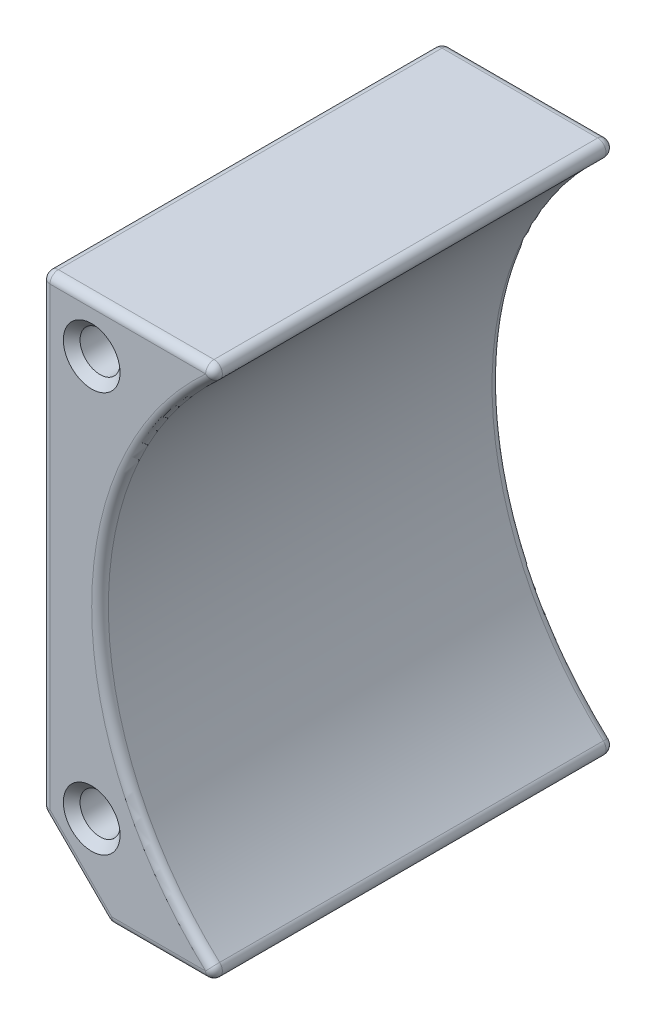
ISO-10303-21;
HEADER;
FILE_DESCRIPTION(('STEP AP214'),'2;1');
FILE_NAME('part.step','',(''),(''),'','','');
FILE_SCHEMA(('AUTOMOTIVE_DESIGN { 1 0 10303 214 1 1 1 1 }'));
ENDSEC;
DATA;
#1=APPLICATION_CONTEXT('core data for automotive mechanical design processes');
#2=APPLICATION_PROTOCOL_DEFINITION('international standard','automotive_design',2000,#1);
#3=PRODUCT_CONTEXT('',#1,'mechanical');
#4=PRODUCT('Part','Part','',(#3));
#5=PRODUCT_RELATED_PRODUCT_CATEGORY('part','',(#4));
#6=PRODUCT_DEFINITION_FORMATION('','',#4);
#7=PRODUCT_DEFINITION_CONTEXT('part definition',#1,'design');
#8=PRODUCT_DEFINITION('design','',#6,#7);
#9=PRODUCT_DEFINITION_SHAPE('','',#8);
#10=(LENGTH_UNIT() NAMED_UNIT(*) SI_UNIT(.MILLI.,.METRE.));
#11=(NAMED_UNIT(*) PLANE_ANGLE_UNIT() SI_UNIT($,.RADIAN.));
#12=(NAMED_UNIT(*) SI_UNIT($,.STERADIAN.) SOLID_ANGLE_UNIT());
#13=UNCERTAINTY_MEASURE_WITH_UNIT(LENGTH_MEASURE(1.E-05),#10,'distance_accuracy_value','');
#14=(GEOMETRIC_REPRESENTATION_CONTEXT(3) GLOBAL_UNCERTAINTY_ASSIGNED_CONTEXT((#13)) GLOBAL_UNIT_ASSIGNED_CONTEXT((#10,
#11,#12)) REPRESENTATION_CONTEXT('',''));
#15=CARTESIAN_POINT('',(0.,0.,0.));
#16=DIRECTION('',(0.,0.,1.));
#17=DIRECTION('',(1.,0.,0.));
#18=AXIS2_PLACEMENT_3D('',#15,#16,#17);
#19=CARTESIAN_POINT('',(0.,0.,38.1));
#20=DIRECTION('',(1.,0.,0.));
#21=DIRECTION('',(0.,0.,-1.));
#22=AXIS2_PLACEMENT_3D('',#19,#20,#21);
#23=PLANE('',#22);
#24=DIRECTION('',(0.,0.,-1.));
#25=VECTOR('',#24,1.);
#26=CARTESIAN_POINT('',(0.,6.67878201513367,38.1));
#27=LINE('',#26,#25);
#28=CARTESIAN_POINT('',(0.,6.67878201513367,0.793750000000003));
#29=VERTEX_POINT('',#28);
#30=CARTESIAN_POINT('',(0.,6.67878201513367,37.30625));
#31=VERTEX_POINT('',#30);
#32=EDGE_CURVE('E205',#29,#31,#27,.F.);
#33=ORIENTED_EDGE('',*,*,#32,.T.);
#34=DIRECTION('',(0.,-1.,0.));
#35=VECTOR('',#34,1.);
#36=CARTESIAN_POINT('',(0.,50.8,37.30625));
#37=LINE('',#36,#35);
#38=CARTESIAN_POINT('',(0.,50.00625,37.30625));
#39=VERTEX_POINT('',#38);
#40=EDGE_CURVE('E208',#31,#39,#37,.F.);
#41=ORIENTED_EDGE('',*,*,#40,.T.);
#42=DIRECTION('',(0.,0.,-1.));
#43=VECTOR('',#42,1.);
#44=CARTESIAN_POINT('',(0.,50.00625,38.1));
#45=LINE('',#44,#43);
#46=CARTESIAN_POINT('',(0.,50.00625,0.793750000000003));
#47=VERTEX_POINT('',#46);
#48=EDGE_CURVE('E203',#39,#47,#45,.T.);
#49=ORIENTED_EDGE('',*,*,#48,.T.);
#50=DIRECTION('',(0.,-1.,0.));
#51=VECTOR('',#50,1.);
#52=CARTESIAN_POINT('',(0.,0.,0.793750000000003));
#53=LINE('',#52,#51);
#54=EDGE_CURVE('E201',#47,#29,#53,.T.);
#55=ORIENTED_EDGE('',*,*,#54,.T.);
#56=EDGE_LOOP('',(#33,#41,#49,#55));
#57=FACE_BOUND('',#56,.T.);
#58=ADVANCED_FACE('F41',(#57),#23,.F.);
#59=CARTESIAN_POINT('',(0.,0.,38.1));
#60=DIRECTION('',(0.,1.,0.));
#61=DIRECTION('',(0.,0.,1.));
#62=AXIS2_PLACEMENT_3D('',#59,#60,#61);
#63=PLANE('',#62);
#64=DIRECTION('',(0.,0.,-1.));
#65=VECTOR('',#64,1.);
#66=CARTESIAN_POINT('',(15.6073041369537,0.,38.1));
#67=LINE('',#66,#65);
#68=CARTESIAN_POINT('',(15.6073041369537,0.,0.793750000000003));
#69=VERTEX_POINT('',#68);
#70=CARTESIAN_POINT('',(15.6073041369537,0.,37.30625));
#71=VERTEX_POINT('',#70);
#72=EDGE_CURVE('E223',#69,#71,#67,.F.);
#73=ORIENTED_EDGE('',*,*,#72,.T.);
#74=DIRECTION('',(1.,0.,0.));
#75=VECTOR('',#74,1.);
#76=CARTESIAN_POINT('',(6.34999999999999,0.,37.30625));
#77=LINE('',#76,#75);
#78=CARTESIAN_POINT('',(6.67878201513364,0.,37.30625));
#79=VERTEX_POINT('',#78);
#80=EDGE_CURVE('E228',#71,#79,#77,.F.);
#81=ORIENTED_EDGE('',*,*,#80,.T.);
#82=DIRECTION('',(0.,0.,1.));
#83=VECTOR('',#82,1.);
#84=CARTESIAN_POINT('',(6.67878201513364,0.,0.));
#85=LINE('',#84,#83);
#86=CARTESIAN_POINT('',(6.67878201513364,0.,0.793750000000003));
#87=VERTEX_POINT('',#86);
#88=EDGE_CURVE('E225',#79,#87,#85,.F.);
#89=ORIENTED_EDGE('',*,*,#88,.T.);
#90=DIRECTION('',(1.,0.,0.));
#91=VECTOR('',#90,1.);
#92=CARTESIAN_POINT('',(0.,0.,0.793750000000003));
#93=LINE('',#92,#91);
#94=EDGE_CURVE('E221',#87,#69,#93,.T.);
#95=ORIENTED_EDGE('',*,*,#94,.T.);
#96=EDGE_LOOP('',(#73,#81,#89,#95));
#97=FACE_BOUND('',#96,.T.);
#98=ADVANCED_FACE('F420',(#97),#63,.F.);
#99=CARTESIAN_POINT('',(38.1,25.4,38.1));
#100=DIRECTION('',(0.,0.,-1.));
#101=DIRECTION('',(-1.,0.,0.));
#102=AXIS2_PLACEMENT_3D('',#99,#100,#101);
#103=CYLINDRICAL_SURFACE('',#102,32.54375);
#104=DIRECTION('',(0.,0.,-1.));
#105=VECTOR('',#104,1.);
#106=CARTESIAN_POINT('',(16.1428445146453,49.4203869047619,38.1));
#107=LINE('',#106,#105);
#108=CARTESIAN_POINT('',(16.1428445146453,49.4203869047619,0.793750000000003));
#109=VERTEX_POINT('',#108);
#110=CARTESIAN_POINT('',(16.1428445146453,49.4203869047619,37.30625));
#111=VERTEX_POINT('',#110);
#112=EDGE_CURVE('E232',#109,#111,#107,.F.);
#113=ORIENTED_EDGE('',*,*,#112,.T.);
#114=CARTESIAN_POINT('',(38.1,25.4,37.30625));
#115=DIRECTION('',(0.,0.,1.));
#116=DIRECTION('',(1.,0.,0.));
#117=AXIS2_PLACEMENT_3D('',#114,#115,#116);
#118=CIRCLE('',#117,32.54375);
#119=CARTESIAN_POINT('',(16.1428445146453,1.37961309523809,37.30625));
#120=VERTEX_POINT('',#119);
#121=EDGE_CURVE('E237',#111,#120,#118,.T.);
#122=ORIENTED_EDGE('',*,*,#121,.T.);
#123=DIRECTION('',(0.,0.,-1.));
#124=VECTOR('',#123,1.);
#125=CARTESIAN_POINT('',(16.1428445146453,1.3796130952381,38.1));
#126=LINE('',#125,#124);
#127=CARTESIAN_POINT('',(16.1428445146453,1.37961309523809,0.793750000000003));
#128=VERTEX_POINT('',#127);
#129=EDGE_CURVE('E234',#120,#128,#126,.T.);
#130=ORIENTED_EDGE('',*,*,#129,.T.);
#131=CARTESIAN_POINT('',(38.1,25.4,0.793750000000003));
#132=DIRECTION('',(0.,0.,1.));
#133=DIRECTION('',(1.,0.,0.));
#134=AXIS2_PLACEMENT_3D('',#131,#132,#133);
#135=CIRCLE('',#134,32.54375);
#136=EDGE_CURVE('E230',#128,#109,#135,.F.);
#137=ORIENTED_EDGE('',*,*,#136,.T.);
#138=EDGE_LOOP('',(#113,#122,#130,#137));
#139=FACE_BOUND('',#138,.T.);
#140=ADVANCED_FACE('F440',(#139),#103,.F.);
#141=CARTESIAN_POINT('',(0.,50.8,38.1));
#142=DIRECTION('',(0.,-1.,0.));
#143=DIRECTION('',(0.,0.,-1.));
#144=AXIS2_PLACEMENT_3D('',#141,#142,#143);
#145=PLANE('',#144);
#146=DIRECTION('',(0.,0.,-1.));
#147=VECTOR('',#146,1.);
#148=CARTESIAN_POINT('',(0.79375,50.8,38.1));
#149=LINE('',#148,#147);
#150=CARTESIAN_POINT('',(0.79375,50.8,0.793750000000003));
#151=VERTEX_POINT('',#150);
#152=CARTESIAN_POINT('',(0.79375,50.8,37.30625));
#153=VERTEX_POINT('',#152);
#154=EDGE_CURVE('E62',#151,#153,#149,.F.);
#155=ORIENTED_EDGE('',*,*,#154,.T.);
#156=DIRECTION('',(-1.,0.,0.));
#157=VECTOR('',#156,1.);
#158=CARTESIAN_POINT('',(17.7545910814626,50.8,37.30625));
#159=LINE('',#158,#157);
#160=CARTESIAN_POINT('',(15.6073041369537,50.8,37.30625));
#161=VERTEX_POINT('',#160);
#162=EDGE_CURVE('E57',#153,#161,#159,.F.);
#163=ORIENTED_EDGE('',*,*,#162,.T.);
#164=DIRECTION('',(0.,0.,-1.));
#165=VECTOR('',#164,1.);
#166=CARTESIAN_POINT('',(15.6073041369537,50.8,38.1));
#167=LINE('',#166,#165);
#168=CARTESIAN_POINT('',(15.6073041369537,50.8,0.793750000000003));
#169=VERTEX_POINT('',#168);
#170=EDGE_CURVE('E242',#161,#169,#167,.T.);
#171=ORIENTED_EDGE('',*,*,#170,.T.);
#172=DIRECTION('',(-1.,0.,0.));
#173=VECTOR('',#172,1.);
#174=CARTESIAN_POINT('',(0.,50.8,0.793750000000003));
#175=LINE('',#174,#173);
#176=EDGE_CURVE('E239',#169,#151,#175,.T.);
#177=ORIENTED_EDGE('',*,*,#176,.T.);
#178=EDGE_LOOP('',(#155,#163,#171,#177));
#179=FACE_BOUND('',#178,.T.);
#180=ADVANCED_FACE('F502',(#179),#145,.F.);
#181=CARTESIAN_POINT('',(38.1,25.4,38.1));
#182=DIRECTION('',(0.,0.,1.));
#183=DIRECTION('',(1.,0.,0.));
#184=AXIS2_PLACEMENT_3D('',#181,#182,#183);
#185=PLANE('',#184);
#186=CARTESIAN_POINT('',(4.7625,7.9375,38.1));
#187=DIRECTION('',(0.,0.,1.));
#188=DIRECTION('',(1.,0.,0.));
#189=AXIS2_PLACEMENT_3D('',#186,#187,#188);
#190=CIRCLE('',#189,2.69875000000003);
#191=CARTESIAN_POINT('',(7.46125000000003,7.9375,38.1));
#192=VERTEX_POINT('',#191);
#193=EDGE_CURVE('E320',#192,#192,#190,.F.);
#194=ORIENTED_EDGE('',*,*,#193,.T.);
#195=EDGE_LOOP('',(#194));
#196=FACE_BOUND('',#195,.T.);
#197=CARTESIAN_POINT('',(4.7625,46.0375,38.1));
#198=DIRECTION('',(0.,0.,1.));
#199=DIRECTION('',(1.,0.,0.));
#200=AXIS2_PLACEMENT_3D('',#197,#198,#199);
#201=CIRCLE('',#200,2.69875000000003);
#202=CARTESIAN_POINT('',(7.46125000000003,46.0375,38.1));
#203=VERTEX_POINT('',#202);
#204=EDGE_CURVE('E317',#203,#203,#201,.F.);
#205=ORIENTED_EDGE('',*,*,#204,.T.);
#206=EDGE_LOOP('',(#205));
#207=FACE_BOUND('',#206,.T.);
#208=DIRECTION('',(1.,0.,0.));
#209=VECTOR('',#208,1.);
#210=CARTESIAN_POINT('',(17.7545910814626,0.793749999999999,38.1));
#211=LINE('',#210,#209);
#212=CARTESIAN_POINT('',(6.67878201513364,0.793749999999999,38.1));
#213=VERTEX_POINT('',#212);
#214=CARTESIAN_POINT('',(15.6073041369537,0.793749999999999,38.1));
#215=VERTEX_POINT('',#214);
#216=EDGE_CURVE('E189',#213,#215,#211,.T.);
#217=ORIENTED_EDGE('',*,*,#216,.T.);
#218=CARTESIAN_POINT('',(38.1,25.4,38.1));
#219=DIRECTION('',(0.,0.,1.));
#220=DIRECTION('',(1.,0.,0.));
#221=AXIS2_PLACEMENT_3D('',#218,#219,#220);
#222=CIRCLE('',#221,33.3375);
#223=CARTESIAN_POINT('',(15.6073041369537,50.00625,38.1));
#224=VERTEX_POINT('',#223);
#225=EDGE_CURVE('E155',#215,#224,#222,.F.);
#226=ORIENTED_EDGE('',*,*,#225,.T.);
#227=DIRECTION('',(-1.,0.,0.));
#228=VECTOR('',#227,1.);
#229=CARTESIAN_POINT('',(0.,50.00625,38.1));
#230=LINE('',#229,#228);
#231=CARTESIAN_POINT('',(0.793750000000003,50.00625,38.1));
#232=VERTEX_POINT('',#231);
#233=EDGE_CURVE('E147',#224,#232,#230,.T.);
#234=ORIENTED_EDGE('',*,*,#233,.T.);
#235=DIRECTION('',(0.,-1.,0.));
#236=VECTOR('',#235,1.);
#237=CARTESIAN_POINT('',(0.793750000000003,6.35000000000002,38.1));
#238=LINE('',#237,#236);
#239=CARTESIAN_POINT('',(0.793750000000003,6.67878201513367,38.1));
#240=VERTEX_POINT('',#239);
#241=EDGE_CURVE('E152',#232,#240,#238,.T.);
#242=ORIENTED_EDGE('',*,*,#241,.T.);
#243=DIRECTION('',(-0.707106781186546,0.707106781186549,0.));
#244=VECTOR('',#243,1.);
#245=CARTESIAN_POINT('',(10.0862660075667,-2.61373399243312,38.1));
#246=LINE('',#245,#244);
#247=EDGE_CURVE('E159',#240,#213,#246,.F.);
#248=ORIENTED_EDGE('',*,*,#247,.T.);
#249=EDGE_LOOP('',(#217,#226,#234,#242,#248));
#250=FACE_BOUND('',#249,.T.);
#251=ADVANCED_FACE('F149',(#196,#207,#250),#185,.T.);
#252=CARTESIAN_POINT('',(38.1,25.4,0.));
#253=DIRECTION('',(0.,0.,1.));
#254=DIRECTION('',(1.,0.,0.));
#255=AXIS2_PLACEMENT_3D('',#252,#253,#254);
#256=PLANE('',#255);
#257=CARTESIAN_POINT('',(4.7625,7.9375,0.));
#258=DIRECTION('',(0.,0.,1.));
#259=DIRECTION('',(1.,0.,0.));
#260=AXIS2_PLACEMENT_3D('',#257,#258,#259);
#261=CIRCLE('',#260,2.69874999999996);
#262=CARTESIAN_POINT('',(7.46124999999996,7.9375,0.));
#263=VERTEX_POINT('',#262);
#264=EDGE_CURVE('E326',#263,#263,#261,.T.);
#265=ORIENTED_EDGE('',*,*,#264,.T.);
#266=EDGE_LOOP('',(#265));
#267=FACE_BOUND('',#266,.T.);
#268=CARTESIAN_POINT('',(4.7625,46.0375,0.));
#269=DIRECTION('',(0.,0.,1.));
#270=DIRECTION('',(1.,0.,0.));
#271=AXIS2_PLACEMENT_3D('',#268,#269,#270);
#272=CIRCLE('',#271,2.69874999999999);
#273=CARTESIAN_POINT('',(7.46124999999999,46.0375,0.));
#274=VERTEX_POINT('',#273);
#275=EDGE_CURVE('E323',#274,#274,#272,.T.);
#276=ORIENTED_EDGE('',*,*,#275,.T.);
#277=EDGE_LOOP('',(#276));
#278=FACE_BOUND('',#277,.T.);
#279=DIRECTION('',(-1.,0.,0.));
#280=VECTOR('',#279,1.);
#281=CARTESIAN_POINT('',(38.1,50.00625,0.));
#282=LINE('',#281,#280);
#283=CARTESIAN_POINT('',(0.79375,50.00625,0.));
#284=VERTEX_POINT('',#283);
#285=CARTESIAN_POINT('',(15.6073041369537,50.00625,0.));
#286=VERTEX_POINT('',#285);
#287=EDGE_CURVE('E212',#284,#286,#282,.F.);
#288=ORIENTED_EDGE('',*,*,#287,.T.);
#289=CARTESIAN_POINT('',(38.1,25.4,0.));
#290=DIRECTION('',(0.,0.,1.));
#291=DIRECTION('',(1.,0.,0.));
#292=AXIS2_PLACEMENT_3D('',#289,#290,#291);
#293=CIRCLE('',#292,33.3375);
#294=CARTESIAN_POINT('',(15.6073041369537,0.79375,0.));
#295=VERTEX_POINT('',#294);
#296=EDGE_CURVE('E219',#286,#295,#293,.T.);
#297=ORIENTED_EDGE('',*,*,#296,.T.);
#298=DIRECTION('',(1.,0.,0.));
#299=VECTOR('',#298,1.);
#300=CARTESIAN_POINT('',(38.1,0.793749999999999,0.));
#301=LINE('',#300,#299);
#302=CARTESIAN_POINT('',(6.67878201513364,0.79375,0.));
#303=VERTEX_POINT('',#302);
#304=EDGE_CURVE('E217',#295,#303,#301,.F.);
#305=ORIENTED_EDGE('',*,*,#304,.T.);
#306=DIRECTION('',(0.707106781186546,-0.707106781186549,0.));
#307=VECTOR('',#306,1.);
#308=CARTESIAN_POINT('',(0.561266007566825,6.91126600756685,0.));
#309=LINE('',#308,#307);
#310=CARTESIAN_POINT('',(0.79375,6.67878201513367,0.));
#311=VERTEX_POINT('',#310);
#312=EDGE_CURVE('E214',#303,#311,#309,.F.);
#313=ORIENTED_EDGE('',*,*,#312,.T.);
#314=DIRECTION('',(0.,-1.,0.));
#315=VECTOR('',#314,1.);
#316=CARTESIAN_POINT('',(0.793750000000003,25.4,0.));
#317=LINE('',#316,#315);
#318=EDGE_CURVE('E210',#311,#284,#317,.F.);
#319=ORIENTED_EDGE('',*,*,#318,.T.);
#320=EDGE_LOOP('',(#288,#297,#305,#313,#319));
#321=FACE_BOUND('',#320,.T.);
#322=ADVANCED_FACE('F338',(#267,#278,#321),#256,.F.);
#323=CARTESIAN_POINT('',(4.7625,7.9375,0.));
#324=DIRECTION('',(0.,0.,1.));
#325=DIRECTION('',(1.,0.,0.));
#326=AXIS2_PLACEMENT_3D('',#323,#324,#325);
#327=CYLINDRICAL_SURFACE('',#326,1.905);
#328=CARTESIAN_POINT('',(4.7625,7.9375,37.30625));
#329=DIRECTION('',(0.,0.,1.));
#330=DIRECTION('',(1.,0.,0.));
#331=AXIS2_PLACEMENT_3D('',#328,#329,#330);
#332=CIRCLE('',#331,1.905);
#333=CARTESIAN_POINT('',(6.6675,7.9375,37.30625));
#334=VERTEX_POINT('',#333);
#335=EDGE_CURVE('E314',#334,#334,#332,.T.);
#336=CARTESIAN_POINT('',(4.7625,7.9375,0.793749999999973));
#337=DIRECTION('',(0.,0.,1.));
#338=DIRECTION('',(1.,0.,0.));
#339=AXIS2_PLACEMENT_3D('',#336,#337,#338);
#340=CIRCLE('',#339,1.905);
#341=CARTESIAN_POINT('',(6.6675,7.9375,0.793749999999973));
#342=VERTEX_POINT('',#341);
#343=EDGE_CURVE('E245',#342,#342,#340,.F.);
#344=CARTESIAN_POINT('',(6.6675,7.9375,37.30625));
#345=CARTESIAN_POINT('',(6.6675,7.9375,36.9259114583333));
#346=CARTESIAN_POINT('',(6.6675,7.9375,36.5455729166666));
#347=CARTESIAN_POINT('',(6.6675,7.9375,35.7848958333333));
#348=CARTESIAN_POINT('',(6.6675,7.9375,35.4045572916666));
#349=CARTESIAN_POINT('',(6.6675,7.9375,34.6438802083333));
#350=CARTESIAN_POINT('',(6.6675,7.9375,34.2635416666666));
#351=CARTESIAN_POINT('',(6.6675,7.9375,33.5028645833333));
#352=CARTESIAN_POINT('',(6.6675,7.9375,33.1225260416666));
#353=CARTESIAN_POINT('',(6.6675,7.9375,32.3618489583333));
#354=CARTESIAN_POINT('',(6.6675,7.9375,31.9815104166666));
#355=CARTESIAN_POINT('',(6.6675,7.9375,31.2208333333333));
#356=CARTESIAN_POINT('',(6.6675,7.9375,30.8404947916666));
#357=CARTESIAN_POINT('',(6.6675,7.9375,30.0798177083333));
#358=CARTESIAN_POINT('',(6.6675,7.9375,29.6994791666666));
#359=CARTESIAN_POINT('',(6.6675,7.9375,28.9388020833333));
#360=CARTESIAN_POINT('',(6.6675,7.9375,28.5584635416666));
#361=CARTESIAN_POINT('',(6.6675,7.9375,27.7977864583333));
#362=CARTESIAN_POINT('',(6.6675,7.9375,27.4174479166666));
#363=CARTESIAN_POINT('',(6.6675,7.9375,26.6567708333333));
#364=CARTESIAN_POINT('',(6.6675,7.9375,26.2764322916666));
#365=CARTESIAN_POINT('',(6.6675,7.9375,25.5157552083333));
#366=CARTESIAN_POINT('',(6.6675,7.9375,25.1354166666666));
#367=CARTESIAN_POINT('',(6.6675,7.9375,24.3747395833333));
#368=CARTESIAN_POINT('',(6.6675,7.9375,23.9944010416666));
#369=CARTESIAN_POINT('',(6.6675,7.9375,23.2337239583333));
#370=CARTESIAN_POINT('',(6.6675,7.9375,22.8533854166666));
#371=CARTESIAN_POINT('',(6.6675,7.9375,22.0927083333333));
#372=CARTESIAN_POINT('',(6.6675,7.9375,21.7123697916666));
#373=CARTESIAN_POINT('',(6.6675,7.9375,20.9516927083333));
#374=CARTESIAN_POINT('',(6.6675,7.9375,20.5713541666666));
#375=CARTESIAN_POINT('',(6.6675,7.9375,19.8106770833333));
#376=CARTESIAN_POINT('',(6.6675,7.9375,19.4303385416666));
#377=CARTESIAN_POINT('',(6.6675,7.9375,18.6696614583333));
#378=CARTESIAN_POINT('',(6.6675,7.9375,18.2893229166666));
#379=CARTESIAN_POINT('',(6.6675,7.9375,17.5286458333333));
#380=CARTESIAN_POINT('',(6.6675,7.9375,17.1483072916666));
#381=CARTESIAN_POINT('',(6.6675,7.9375,16.3876302083333));
#382=CARTESIAN_POINT('',(6.6675,7.9375,16.0072916666666));
#383=CARTESIAN_POINT('',(6.6675,7.9375,15.2466145833333));
#384=CARTESIAN_POINT('',(6.6675,7.9375,14.8662760416666));
#385=CARTESIAN_POINT('',(6.6675,7.9375,14.1055989583333));
#386=CARTESIAN_POINT('',(6.6675,7.9375,13.7252604166666));
#387=CARTESIAN_POINT('',(6.6675,7.9375,12.9645833333333));
#388=CARTESIAN_POINT('',(6.6675,7.9375,12.5842447916666));
#389=CARTESIAN_POINT('',(6.6675,7.9375,11.8235677083333));
#390=CARTESIAN_POINT('',(6.6675,7.9375,11.4432291666666));
#391=CARTESIAN_POINT('',(6.6675,7.9375,10.6825520833333));
#392=CARTESIAN_POINT('',(6.6675,7.9375,10.3022135416666));
#393=CARTESIAN_POINT('',(6.6675,7.9375,9.54153645833331));
#394=CARTESIAN_POINT('',(6.6675,7.9375,9.16119791666664));
#395=CARTESIAN_POINT('',(6.6675,7.9375,8.40052083333331));
#396=CARTESIAN_POINT('',(6.6675,7.9375,8.02018229166664));
#397=CARTESIAN_POINT('',(6.6675,7.9375,7.25950520833331));
#398=CARTESIAN_POINT('',(6.6675,7.9375,6.87916666666664));
#399=CARTESIAN_POINT('',(6.6675,7.9375,6.11848958333331));
#400=CARTESIAN_POINT('',(6.6675,7.9375,5.73815104166664));
#401=CARTESIAN_POINT('',(6.6675,7.9375,4.97747395833331));
#402=CARTESIAN_POINT('',(6.6675,7.9375,4.59713541666664));
#403=CARTESIAN_POINT('',(6.6675,7.9375,3.83645833333331));
#404=CARTESIAN_POINT('',(6.6675,7.9375,3.45611979166664));
#405=CARTESIAN_POINT('',(6.6675,7.9375,2.69544270833331));
#406=CARTESIAN_POINT('',(6.6675,7.9375,2.31510416666664));
#407=CARTESIAN_POINT('',(6.6675,7.9375,1.55442708333331));
#408=CARTESIAN_POINT('',(6.6675,7.9375,1.17408854166664));
#409=CARTESIAN_POINT('',(6.6675,7.9375,0.793749999999975));
#410=B_SPLINE_CURVE_WITH_KNOTS('',3,(#344,#345,#346,#347,#348,#349,#350,#351,#352,#353,#354,
#355,#356,#357,#358,#359,#360,#361,#362,#363,#364,#365,#366,#367,#368,#369,#370,#371,#372,#373,
#374,#375,#376,#377,#378,#379,#380,#381,#382,#383,#384,#385,#386,#387,#388,#389,#390,#391,#392,
#393,#394,#395,#396,#397,#398,#399,#400,#401,#402,#403,#404,#405,#406,#407,#408,#409),
.UNSPECIFIED.,.F.,.F.,(4,2,2,2,2,2,2,2,2,2,2,2,2,2,2,2,2,2,2,2,2,2,2,2,2,2,2,2,2,2,2,2,4),(0.,
1.141015625,2.28203125,3.423046875,4.5640625,5.705078125,6.84609374999999,7.987109375,9.128125,
10.269140625,11.41015625,12.551171875,13.6921875,14.833203125,15.97421875,17.115234375,18.25625,
19.397265625,20.53828125,21.679296875,22.8203125,23.961328125,25.10234375,26.243359375,
27.384375,28.525390625,29.66640625,30.807421875,31.9484375,33.089453125,34.23046875,
35.371484375,36.5125),.UNSPECIFIED.);
#411=EDGE_CURVE('BSEAM341',#334,#342,#410,.T.);
#412=ORIENTED_EDGE('',*,*,#335,.T.);
#413=ORIENTED_EDGE('',*,*,#343,.T.);
#414=ORIENTED_EDGE('',*,*,#411,.T.);
#415=ORIENTED_EDGE('',*,*,#411,.F.);
#416=EDGE_LOOP('',(#412,#414,#413,#415));
#417=FACE_BOUND('',#416,.T.);
#418=ADVANCED_FACE('F341',(#417),#327,.F.);
#419=CARTESIAN_POINT('',(4.7625,46.0375,0.));
#420=DIRECTION('',(0.,0.,1.));
#421=DIRECTION('',(1.,0.,0.));
#422=AXIS2_PLACEMENT_3D('',#419,#420,#421);
#423=CYLINDRICAL_SURFACE('',#422,1.905);
#424=CARTESIAN_POINT('',(4.7625,46.0375,37.30625));
#425=DIRECTION('',(0.,0.,1.));
#426=DIRECTION('',(1.,0.,0.));
#427=AXIS2_PLACEMENT_3D('',#424,#425,#426);
#428=CIRCLE('',#427,1.905);
#429=CARTESIAN_POINT('',(6.6675,46.0375,37.30625));
#430=VERTEX_POINT('',#429);
#431=EDGE_CURVE('E11',#430,#430,#428,.T.);
#432=CARTESIAN_POINT('',(4.7625,46.0375,0.793749999999995));
#433=DIRECTION('',(0.,0.,1.));
#434=DIRECTION('',(1.,0.,0.));
#435=AXIS2_PLACEMENT_3D('',#432,#433,#434);
#436=CIRCLE('',#435,1.905);
#437=CARTESIAN_POINT('',(6.6675,46.0375,0.793749999999994));
#438=VERTEX_POINT('',#437);
#439=EDGE_CURVE('E50',#438,#438,#436,.F.);
#440=CARTESIAN_POINT('',(6.6675,46.0375,37.30625));
#441=CARTESIAN_POINT('',(6.6675,46.0375,36.9259114583333));
#442=CARTESIAN_POINT('',(6.6675,46.0375,36.5455729166666));
#443=CARTESIAN_POINT('',(6.6675,46.0375,35.7848958333333));
#444=CARTESIAN_POINT('',(6.6675,46.0375,35.4045572916666));
#445=CARTESIAN_POINT('',(6.6675,46.0375,34.6438802083333));
#446=CARTESIAN_POINT('',(6.6675,46.0375,34.2635416666666));
#447=CARTESIAN_POINT('',(6.6675,46.0375,33.5028645833333));
#448=CARTESIAN_POINT('',(6.6675,46.0375,33.1225260416666));
#449=CARTESIAN_POINT('',(6.6675,46.0375,32.3618489583333));
#450=CARTESIAN_POINT('',(6.6675,46.0375,31.9815104166666));
#451=CARTESIAN_POINT('',(6.6675,46.0375,31.2208333333333));
#452=CARTESIAN_POINT('',(6.6675,46.0375,30.8404947916666));
#453=CARTESIAN_POINT('',(6.6675,46.0375,30.0798177083333));
#454=CARTESIAN_POINT('',(6.6675,46.0375,29.6994791666666));
#455=CARTESIAN_POINT('',(6.6675,46.0375,28.9388020833333));
#456=CARTESIAN_POINT('',(6.6675,46.0375,28.5584635416666));
#457=CARTESIAN_POINT('',(6.6675,46.0375,27.7977864583333));
#458=CARTESIAN_POINT('',(6.6675,46.0375,27.4174479166666));
#459=CARTESIAN_POINT('',(6.6675,46.0375,26.6567708333333));
#460=CARTESIAN_POINT('',(6.6675,46.0375,26.2764322916666));
#461=CARTESIAN_POINT('',(6.6675,46.0375,25.5157552083333));
#462=CARTESIAN_POINT('',(6.6675,46.0375,25.1354166666666));
#463=CARTESIAN_POINT('',(6.6675,46.0375,24.3747395833333));
#464=CARTESIAN_POINT('',(6.6675,46.0375,23.9944010416666));
#465=CARTESIAN_POINT('',(6.6675,46.0375,23.2337239583333));
#466=CARTESIAN_POINT('',(6.6675,46.0375,22.8533854166666));
#467=CARTESIAN_POINT('',(6.6675,46.0375,22.0927083333333));
#468=CARTESIAN_POINT('',(6.6675,46.0375,21.7123697916666));
#469=CARTESIAN_POINT('',(6.6675,46.0375,20.9516927083333));
#470=CARTESIAN_POINT('',(6.6675,46.0375,20.5713541666666));
#471=CARTESIAN_POINT('',(6.6675,46.0375,19.8106770833333));
#472=CARTESIAN_POINT('',(6.6675,46.0375,19.4303385416666));
#473=CARTESIAN_POINT('',(6.6675,46.0375,18.6696614583333));
#474=CARTESIAN_POINT('',(6.6675,46.0375,18.2893229166666));
#475=CARTESIAN_POINT('',(6.6675,46.0375,17.5286458333333));
#476=CARTESIAN_POINT('',(6.6675,46.0375,17.1483072916667));
#477=CARTESIAN_POINT('',(6.6675,46.0375,16.3876302083333));
#478=CARTESIAN_POINT('',(6.6675,46.0375,16.0072916666666));
#479=CARTESIAN_POINT('',(6.6675,46.0375,15.2466145833333));
#480=CARTESIAN_POINT('',(6.6675,46.0375,14.8662760416666));
#481=CARTESIAN_POINT('',(6.6675,46.0375,14.1055989583333));
#482=CARTESIAN_POINT('',(6.6675,46.0375,13.7252604166667));
#483=CARTESIAN_POINT('',(6.6675,46.0375,12.9645833333333));
#484=CARTESIAN_POINT('',(6.6675,46.0375,12.5842447916667));
#485=CARTESIAN_POINT('',(6.6675,46.0375,11.8235677083333));
#486=CARTESIAN_POINT('',(6.6675,46.0375,11.4432291666667));
#487=CARTESIAN_POINT('',(6.6675,46.0375,10.6825520833333));
#488=CARTESIAN_POINT('',(6.6675,46.0375,10.3022135416667));
#489=CARTESIAN_POINT('',(6.6675,46.0375,9.54153645833332));
#490=CARTESIAN_POINT('',(6.6675,46.0375,9.16119791666666));
#491=CARTESIAN_POINT('',(6.6675,46.0375,8.40052083333332));
#492=CARTESIAN_POINT('',(6.6675,46.0375,8.02018229166666));
#493=CARTESIAN_POINT('',(6.6675,46.0375,7.25950520833332));
#494=CARTESIAN_POINT('',(6.6675,46.0375,6.87916666666666));
#495=CARTESIAN_POINT('',(6.6675,46.0375,6.11848958333332));
#496=CARTESIAN_POINT('',(6.6675,46.0375,5.73815104166666));
#497=CARTESIAN_POINT('',(6.6675,46.0375,4.97747395833332));
#498=CARTESIAN_POINT('',(6.6675,46.0375,4.59713541666666));
#499=CARTESIAN_POINT('',(6.6675,46.0375,3.83645833333332));
#500=CARTESIAN_POINT('',(6.6675,46.0375,3.45611979166666));
#501=CARTESIAN_POINT('',(6.6675,46.0375,2.69544270833333));
#502=CARTESIAN_POINT('',(6.6675,46.0375,2.31510416666666));
#503=CARTESIAN_POINT('',(6.6675,46.0375,1.55442708333333));
#504=CARTESIAN_POINT('',(6.6675,46.0375,1.17408854166666));
#505=CARTESIAN_POINT('',(6.6675,46.0375,0.793749999999996));
#506=B_SPLINE_CURVE_WITH_KNOTS('',3,(#440,#441,#442,#443,#444,#445,#446,#447,#448,#449,#450,
#451,#452,#453,#454,#455,#456,#457,#458,#459,#460,#461,#462,#463,#464,#465,#466,#467,#468,#469,
#470,#471,#472,#473,#474,#475,#476,#477,#478,#479,#480,#481,#482,#483,#484,#485,#486,#487,#488,
#489,#490,#491,#492,#493,#494,#495,#496,#497,#498,#499,#500,#501,#502,#503,#504,#505),
.UNSPECIFIED.,.F.,.F.,(4,2,2,2,2,2,2,2,2,2,2,2,2,2,2,2,2,2,2,2,2,2,2,2,2,2,2,2,2,2,2,2,4),(0.,
1.141015625,2.28203125,3.42304687499999,4.56406249999999,5.705078125,6.84609374999999,
7.98710937499999,9.12812499999999,10.269140625,11.41015625,12.551171875,13.6921875,14.833203125,
15.97421875,17.115234375,18.25625,19.397265625,20.53828125,21.679296875,22.8203125,23.961328125,
25.10234375,26.243359375,27.384375,28.525390625,29.66640625,30.807421875,31.9484375,
33.089453125,34.23046875,35.371484375,36.5125),.UNSPECIFIED.);
#507=EDGE_CURVE('BSEAM331',#430,#438,#506,.T.);
#508=ORIENTED_EDGE('',*,*,#431,.T.);
#509=ORIENTED_EDGE('',*,*,#439,.T.);
#510=ORIENTED_EDGE('',*,*,#507,.T.);
#511=ORIENTED_EDGE('',*,*,#507,.F.);
#512=EDGE_LOOP('',(#508,#510,#509,#511));
#513=FACE_BOUND('',#512,.T.);
#514=ADVANCED_FACE('F331',(#513),#423,.F.);
#515=CARTESIAN_POINT('',(6.34999999999999,0.,38.1));
#516=DIRECTION('',(0.707106781186549,0.707106781186546,0.));
#517=DIRECTION('',(0.,0.,-1.));
#518=AXIS2_PLACEMENT_3D('',#515,#516,#517);
#519=PLANE('',#518);
#520=DIRECTION('',(0.,0.,-1.));
#521=VECTOR('',#520,1.);
#522=CARTESIAN_POINT('',(6.11751600756681,0.23248399243318,38.1));
#523=LINE('',#522,#521);
#524=CARTESIAN_POINT('',(6.11751600756681,0.23248399243318,0.79375));
#525=VERTEX_POINT('',#524);
#526=CARTESIAN_POINT('',(6.11751600756681,0.23248399243318,37.30625));
#527=VERTEX_POINT('',#526);
#528=EDGE_CURVE('E192',#525,#527,#523,.F.);
#529=ORIENTED_EDGE('',*,*,#528,.T.);
#530=DIRECTION('',(0.707106781186546,-0.707106781186549,0.));
#531=VECTOR('',#530,1.);
#532=CARTESIAN_POINT('',(6.34999999999999,0.,37.30625));
#533=LINE('',#532,#531);
#534=CARTESIAN_POINT('',(0.232483992433177,6.11751600756685,37.30625));
#535=VERTEX_POINT('',#534);
#536=EDGE_CURVE('E198',#527,#535,#533,.F.);
#537=ORIENTED_EDGE('',*,*,#536,.T.);
#538=DIRECTION('',(0.,0.,1.));
#539=VECTOR('',#538,1.);
#540=CARTESIAN_POINT('',(0.232483992433176,6.11751600756684,0.));
#541=LINE('',#540,#539);
#542=CARTESIAN_POINT('',(0.232483992433177,6.11751600756685,0.79375));
#543=VERTEX_POINT('',#542);
#544=EDGE_CURVE('E196',#535,#543,#541,.F.);
#545=ORIENTED_EDGE('',*,*,#544,.T.);
#546=DIRECTION('',(-0.707106781186546,0.707106781186549,0.));
#547=VECTOR('',#546,1.);
#548=CARTESIAN_POINT('',(6.34999999999999,0.,0.79375));
#549=LINE('',#548,#547);
#550=EDGE_CURVE('E194',#543,#525,#549,.F.);
#551=ORIENTED_EDGE('',*,*,#550,.T.);
#552=EDGE_LOOP('',(#529,#537,#545,#551));
#553=FACE_BOUND('',#552,.T.);
#554=ADVANCED_FACE('F445',(#553),#519,.F.);
#555=CARTESIAN_POINT('',(15.6073041369537,50.00625,0.79375));
#556=DIRECTION('',(0.,0.,-1.));
#557=DIRECTION('',(-1.,0.,0.));
#558=AXIS2_PLACEMENT_3D('',#555,#556,#557);
#559=SPHERICAL_SURFACE('',#558,0.79375);
#560=CARTESIAN_POINT('',(15.6073041369537,50.00625,0.793750000000003));
#561=DIRECTION('',(0.738095238095237,0.674696538824037,0.));
#562=DIRECTION('',(-0.674696538824037,0.738095238095237,0.));
#563=AXIS2_PLACEMENT_3D('',#560,#561,#562);
#564=CIRCLE('',#563,0.79375);
#565=EDGE_CURVE('E307',#286,#109,#564,.F.);
#566=ORIENTED_EDGE('',*,*,#565,.F.);
#567=CARTESIAN_POINT('',(15.6073041369537,50.00625,0.79375));
#568=DIRECTION('',(1.,0.,0.));
#569=DIRECTION('',(0.,0.,-1.));
#570=AXIS2_PLACEMENT_3D('',#567,#568,#569);
#571=CIRCLE('',#570,0.79375);
#572=EDGE_CURVE('E182',#169,#286,#571,.F.);
#573=ORIENTED_EDGE('',*,*,#572,.F.);
#574=CARTESIAN_POINT('',(15.6073041369537,50.00625,0.793750000000003));
#575=DIRECTION('',(0.,0.,-1.));
#576=DIRECTION('',(-1.,0.,0.));
#577=AXIS2_PLACEMENT_3D('',#574,#575,#576);
#578=CIRCLE('',#577,0.79375);
#579=EDGE_CURVE('E185',#109,#169,#578,.F.);
#580=ORIENTED_EDGE('',*,*,#579,.F.);
#581=EDGE_LOOP('',(#566,#573,#580));
#582=FACE_BOUND('',#581,.T.);
#583=ADVANCED_FACE('F355',(#582),#559,.T.);
#584=CARTESIAN_POINT('',(0.,50.00625,0.793750000000003));
#585=DIRECTION('',(-1.,0.,0.));
#586=DIRECTION('',(0.,0.,1.));
#587=AXIS2_PLACEMENT_3D('',#584,#585,#586);
#588=CYLINDRICAL_SURFACE('',#587,0.79375);
#589=ORIENTED_EDGE('',*,*,#572,.T.);
#590=ORIENTED_EDGE('',*,*,#287,.F.);
#591=CARTESIAN_POINT('',(0.79375,50.00625,0.793750000000003));
#592=DIRECTION('',(-1.,0.,0.));
#593=DIRECTION('',(0.,0.,1.));
#594=AXIS2_PLACEMENT_3D('',#591,#592,#593);
#595=CIRCLE('',#594,0.79375);
#596=EDGE_CURVE('E304',#151,#284,#595,.T.);
#597=ORIENTED_EDGE('',*,*,#596,.F.);
#598=ORIENTED_EDGE('',*,*,#176,.F.);
#599=EDGE_LOOP('',(#589,#590,#597,#598));
#600=FACE_BOUND('',#599,.T.);
#601=ADVANCED_FACE('F352',(#600),#588,.T.);
#602=CARTESIAN_POINT('',(15.6073041369537,50.00625,38.1));
#603=DIRECTION('',(0.,0.,-1.));
#604=DIRECTION('',(-1.,0.,0.));
#605=AXIS2_PLACEMENT_3D('',#602,#603,#604);
#606=CYLINDRICAL_SURFACE('',#605,0.79375);
#607=ORIENTED_EDGE('',*,*,#579,.T.);
#608=ORIENTED_EDGE('',*,*,#170,.F.);
#609=CARTESIAN_POINT('',(15.6073041369537,50.00625,37.30625));
#610=DIRECTION('',(0.,0.,1.));
#611=DIRECTION('',(1.,0.,0.));
#612=AXIS2_PLACEMENT_3D('',#609,#610,#611);
#613=CIRCLE('',#612,0.79375);
#614=EDGE_CURVE('E301',#111,#161,#613,.T.);
#615=ORIENTED_EDGE('',*,*,#614,.F.);
#616=ORIENTED_EDGE('',*,*,#112,.F.);
#617=EDGE_LOOP('',(#607,#608,#615,#616));
#618=FACE_BOUND('',#617,.T.);
#619=ADVANCED_FACE('F676',(#618),#606,.T.);
#620=CARTESIAN_POINT('',(38.1,25.4,0.793750000000003));
#621=DIRECTION('',(0.,0.,1.));
#622=DIRECTION('',(1.,0.,0.));
#623=AXIS2_PLACEMENT_3D('',#620,#621,#622);
#624=TOROIDAL_SURFACE('',#623,33.3375,0.79375);
#625=ORIENTED_EDGE('',*,*,#565,.T.);
#626=ORIENTED_EDGE('',*,*,#136,.F.);
#627=CARTESIAN_POINT('',(15.6073041369537,0.79375,0.79375));
#628=DIRECTION('',(0.738095238095234,-0.67469653882404,0.));
#629=DIRECTION('',(0.67469653882404,0.738095238095234,0.));
#630=AXIS2_PLACEMENT_3D('',#627,#628,#629);
#631=CIRCLE('',#630,0.79375);
#632=EDGE_CURVE('E298',#295,#128,#631,.T.);
#633=ORIENTED_EDGE('',*,*,#632,.F.);
#634=ORIENTED_EDGE('',*,*,#296,.F.);
#635=EDGE_LOOP('',(#625,#626,#633,#634));
#636=FACE_BOUND('',#635,.T.);
#637=ADVANCED_FACE('F359',(#636),#624,.T.);
#638=CARTESIAN_POINT('',(0.79375,50.00625,0.79375));
#639=DIRECTION('',(0.,0.,-1.));
#640=DIRECTION('',(-1.,0.,0.));
#641=AXIS2_PLACEMENT_3D('',#638,#639,#640);
#642=SPHERICAL_SURFACE('',#641,0.79375);
#643=CARTESIAN_POINT('',(0.79375,50.00625,0.793750000000003));
#644=DIRECTION('',(0.,0.,-1.));
#645=DIRECTION('',(-1.,0.,0.));
#646=AXIS2_PLACEMENT_3D('',#643,#644,#645);
#647=CIRCLE('',#646,0.79375);
#648=EDGE_CURVE('E292',#151,#47,#647,.F.);
#649=ORIENTED_EDGE('',*,*,#648,.F.);
#650=ORIENTED_EDGE('',*,*,#596,.T.);
#651=CARTESIAN_POINT('',(0.79375,50.00625,0.79375));
#652=DIRECTION('',(0.,1.,0.));
#653=DIRECTION('',(0.,0.,1.));
#654=AXIS2_PLACEMENT_3D('',#651,#652,#653);
#655=CIRCLE('',#654,0.79375);
#656=EDGE_CURVE('E295',#47,#284,#655,.F.);
#657=ORIENTED_EDGE('',*,*,#656,.F.);
#658=EDGE_LOOP('',(#649,#650,#657));
#659=FACE_BOUND('',#658,.T.);
#660=ADVANCED_FACE('F386',(#659),#642,.T.);
#661=CARTESIAN_POINT('',(15.6073041369537,50.00625,37.30625));
#662=DIRECTION('',(0.,0.,1.));
#663=DIRECTION('',(1.,0.,0.));
#664=AXIS2_PLACEMENT_3D('',#661,#662,#663);
#665=SPHERICAL_SURFACE('',#664,0.79375);
#666=CARTESIAN_POINT('',(15.6073041369537,50.00625,37.30625));
#667=DIRECTION('',(0.738095238095235,0.674696538824039,0.));
#668=DIRECTION('',(-0.674696538824039,0.738095238095235,0.));
#669=AXIS2_PLACEMENT_3D('',#666,#667,#668);
#670=CIRCLE('',#669,0.79375);
#671=EDGE_CURVE('E288',#111,#224,#670,.F.);
#672=ORIENTED_EDGE('',*,*,#671,.F.);
#673=ORIENTED_EDGE('',*,*,#614,.T.);
#674=CARTESIAN_POINT('',(15.6073041369537,50.00625,37.30625));
#675=DIRECTION('',(1.,0.,0.));
#676=DIRECTION('',(0.,0.,-1.));
#677=AXIS2_PLACEMENT_3D('',#674,#675,#676);
#678=CIRCLE('',#677,0.79375);
#679=EDGE_CURVE('E290',#224,#161,#678,.F.);
#680=ORIENTED_EDGE('',*,*,#679,.F.);
#681=EDGE_LOOP('',(#672,#673,#680));
#682=FACE_BOUND('',#681,.T.);
#683=ADVANCED_FACE('F653',(#682),#665,.T.);
#684=CARTESIAN_POINT('',(15.6073041369537,0.79375,0.79375));
#685=DIRECTION('',(0.,0.,-1.));
#686=DIRECTION('',(-1.,0.,0.));
#687=AXIS2_PLACEMENT_3D('',#684,#685,#686);
#688=SPHERICAL_SURFACE('',#687,0.79375);
#689=CARTESIAN_POINT('',(15.6073041369537,0.79375,0.793750000000003));
#690=DIRECTION('',(1.,0.,0.));
#691=DIRECTION('',(0.,0.,-1.));
#692=AXIS2_PLACEMENT_3D('',#689,#690,#691);
#693=CIRCLE('',#692,0.79375);
#694=EDGE_CURVE('E283',#295,#69,#693,.F.);
#695=ORIENTED_EDGE('',*,*,#694,.F.);
#696=ORIENTED_EDGE('',*,*,#632,.T.);
#697=CARTESIAN_POINT('',(15.6073041369537,0.793749999999999,0.793750000000003));
#698=DIRECTION('',(0.,0.,-1.));
#699=DIRECTION('',(-1.,0.,0.));
#700=AXIS2_PLACEMENT_3D('',#697,#698,#699);
#701=CIRCLE('',#700,0.79375);
#702=EDGE_CURVE('E286',#69,#128,#701,.F.);
#703=ORIENTED_EDGE('',*,*,#702,.F.);
#704=EDGE_LOOP('',(#695,#696,#703));
#705=FACE_BOUND('',#704,.T.);
#706=ADVANCED_FACE('F364',(#705),#688,.T.);
#707=CARTESIAN_POINT('',(0.79375,0.,0.793750000000003));
#708=DIRECTION('',(0.,-1.,0.));
#709=DIRECTION('',(0.,0.,-1.));
#710=AXIS2_PLACEMENT_3D('',#707,#708,#709);
#711=CYLINDRICAL_SURFACE('',#710,0.79375);
#712=ORIENTED_EDGE('',*,*,#656,.T.);
#713=ORIENTED_EDGE('',*,*,#318,.F.);
#714=CARTESIAN_POINT('',(0.79375,6.67878201513367,0.793750000000003));
#715=DIRECTION('',(0.,-1.,0.));
#716=DIRECTION('',(0.,0.,-1.));
#717=AXIS2_PLACEMENT_3D('',#714,#715,#716);
#718=CIRCLE('',#717,0.79375);
#719=EDGE_CURVE('E278',#29,#311,#718,.T.);
#720=ORIENTED_EDGE('',*,*,#719,.F.);
#721=ORIENTED_EDGE('',*,*,#54,.F.);
#722=EDGE_LOOP('',(#712,#713,#720,#721));
#723=FACE_BOUND('',#722,.T.);
#724=ADVANCED_FACE('F381',(#723),#711,.T.);
#725=CARTESIAN_POINT('',(0.79375,50.00625,38.1));
#726=DIRECTION('',(0.,0.,-1.));
#727=DIRECTION('',(-1.,0.,0.));
#728=AXIS2_PLACEMENT_3D('',#725,#726,#727);
#729=CYLINDRICAL_SURFACE('',#728,0.79375);
#730=ORIENTED_EDGE('',*,*,#648,.T.);
#731=ORIENTED_EDGE('',*,*,#48,.F.);
#732=CARTESIAN_POINT('',(0.79375,50.00625,37.30625));
#733=DIRECTION('',(0.,0.,1.));
#734=DIRECTION('',(1.,0.,0.));
#735=AXIS2_PLACEMENT_3D('',#732,#733,#734);
#736=CIRCLE('',#735,0.79375);
#737=EDGE_CURVE('E168',#153,#39,#736,.T.);
#738=ORIENTED_EDGE('',*,*,#737,.F.);
#739=ORIENTED_EDGE('',*,*,#154,.F.);
#740=EDGE_LOOP('',(#730,#731,#738,#739));
#741=FACE_BOUND('',#740,.T.);
#742=ADVANCED_FACE('F389',(#741),#729,.T.);
#743=CARTESIAN_POINT('',(38.1,50.00625,37.30625));
#744=DIRECTION('',(1.,0.,0.));
#745=DIRECTION('',(0.,0.,-1.));
#746=AXIS2_PLACEMENT_3D('',#743,#744,#745);
#747=CYLINDRICAL_SURFACE('',#746,0.79375);
#748=ORIENTED_EDGE('',*,*,#679,.T.);
#749=ORIENTED_EDGE('',*,*,#162,.F.);
#750=CARTESIAN_POINT('',(0.793750000000003,50.00625,37.30625));
#751=DIRECTION('',(-1.,0.,0.));
#752=DIRECTION('',(0.,-1.,0.));
#753=AXIS2_PLACEMENT_3D('',#750,#751,#752);
#754=CIRCLE('',#753,0.79375);
#755=EDGE_CURVE('E162',#232,#153,#754,.T.);
#756=ORIENTED_EDGE('',*,*,#755,.F.);
#757=ORIENTED_EDGE('',*,*,#233,.F.);
#758=EDGE_LOOP('',(#748,#749,#756,#757));
#759=FACE_BOUND('',#758,.T.);
#760=ADVANCED_FACE('F164',(#759),#747,.T.);
#761=CARTESIAN_POINT('',(38.1,25.4,37.30625));
#762=DIRECTION('',(0.,0.,1.));
#763=DIRECTION('',(1.,0.,0.));
#764=AXIS2_PLACEMENT_3D('',#761,#762,#763);
#765=TOROIDAL_SURFACE('',#764,33.3375,0.79375);
#766=ORIENTED_EDGE('',*,*,#671,.T.);
#767=ORIENTED_EDGE('',*,*,#225,.F.);
#768=CARTESIAN_POINT('',(15.6073041369537,0.793749999999999,37.30625));
#769=DIRECTION('',(0.738095238095238,-0.674696538824036,0.));
#770=DIRECTION('',(0.674696538824036,0.738095238095238,0.));
#771=AXIS2_PLACEMENT_3D('',#768,#769,#770);
#772=CIRCLE('',#771,0.79375);
#773=EDGE_CURVE('E169',#120,#215,#772,.T.);
#774=ORIENTED_EDGE('',*,*,#773,.F.);
#775=ORIENTED_EDGE('',*,*,#121,.F.);
#776=EDGE_LOOP('',(#766,#767,#774,#775));
#777=FACE_BOUND('',#776,.T.);
#778=ADVANCED_FACE('F408',(#777),#765,.T.);
#779=CARTESIAN_POINT('',(15.6073041369537,0.793749999999999,38.1));
#780=DIRECTION('',(0.,0.,-1.));
#781=DIRECTION('',(-1.,0.,0.));
#782=AXIS2_PLACEMENT_3D('',#779,#780,#781);
#783=CYLINDRICAL_SURFACE('',#782,0.79375);
#784=ORIENTED_EDGE('',*,*,#702,.T.);
#785=ORIENTED_EDGE('',*,*,#129,.F.);
#786=CARTESIAN_POINT('',(15.6073041369537,0.79375,37.30625));
#787=DIRECTION('',(0.,0.,1.));
#788=DIRECTION('',(1.,0.,0.));
#789=AXIS2_PLACEMENT_3D('',#786,#787,#788);
#790=CIRCLE('',#789,0.79375);
#791=EDGE_CURVE('E272',#71,#120,#790,.T.);
#792=ORIENTED_EDGE('',*,*,#791,.F.);
#793=ORIENTED_EDGE('',*,*,#72,.F.);
#794=EDGE_LOOP('',(#784,#785,#792,#793));
#795=FACE_BOUND('',#794,.T.);
#796=ADVANCED_FACE('F609',(#795),#783,.T.);
#797=CARTESIAN_POINT('',(0.,0.79375,0.793750000000003));
#798=DIRECTION('',(1.,0.,0.));
#799=DIRECTION('',(0.,0.,-1.));
#800=AXIS2_PLACEMENT_3D('',#797,#798,#799);
#801=CYLINDRICAL_SURFACE('',#800,0.79375);
#802=ORIENTED_EDGE('',*,*,#694,.T.);
#803=ORIENTED_EDGE('',*,*,#94,.F.);
#804=CARTESIAN_POINT('',(6.67878201513364,0.79375,0.79375));
#805=DIRECTION('',(-1.,0.,0.));
#806=DIRECTION('',(0.,-1.,0.));
#807=AXIS2_PLACEMENT_3D('',#804,#805,#806);
#808=CIRCLE('',#807,0.79375);
#809=EDGE_CURVE('E269',#303,#87,#808,.T.);
#810=ORIENTED_EDGE('',*,*,#809,.F.);
#811=ORIENTED_EDGE('',*,*,#304,.F.);
#812=EDGE_LOOP('',(#802,#803,#810,#811));
#813=FACE_BOUND('',#812,.T.);
#814=ADVANCED_FACE('F369',(#813),#801,.T.);
#815=CARTESIAN_POINT('',(10.0862660075667,-2.61373399243312,0.79375));
#816=DIRECTION('',(-0.707106781186546,0.707106781186549,0.));
#817=DIRECTION('',(-0.707106781186549,-0.707106781186546,0.));
#818=AXIS2_PLACEMENT_3D('',#815,#816,#817);
#819=CYLINDRICAL_SURFACE('',#818,0.79375);
#820=CARTESIAN_POINT('',(0.79375,6.67878201513367,0.79375));
#821=DIRECTION('',(-0.707106781186548,0.707106781186547,0.));
#822=DIRECTION('',(-0.707106781186547,-0.707106781186548,0.));
#823=AXIS2_PLACEMENT_3D('',#820,#821,#822);
#824=CIRCLE('',#823,0.79375);
#825=EDGE_CURVE('E280',#311,#543,#824,.T.);
#826=ORIENTED_EDGE('',*,*,#825,.F.);
#827=ORIENTED_EDGE('',*,*,#312,.F.);
#828=CARTESIAN_POINT('',(6.67878201513364,0.79375,0.79375));
#829=DIRECTION('',(0.707106781186546,-0.707106781186549,0.));
#830=DIRECTION('',(0.707106781186549,0.707106781186546,0.));
#831=AXIS2_PLACEMENT_3D('',#828,#829,#830);
#832=CIRCLE('',#831,0.79375);
#833=EDGE_CURVE('E266',#525,#303,#832,.T.);
#834=ORIENTED_EDGE('',*,*,#833,.F.);
#835=ORIENTED_EDGE('',*,*,#550,.F.);
#836=EDGE_LOOP('',(#826,#827,#834,#835));
#837=FACE_BOUND('',#836,.T.);
#838=ADVANCED_FACE('F374',(#837),#819,.T.);
#839=CARTESIAN_POINT('',(0.79375,6.67878201513367,0.79375));
#840=DIRECTION('',(0.,0.,-1.));
#841=DIRECTION('',(0.,1.,0.));
#842=AXIS2_PLACEMENT_3D('',#839,#840,#841);
#843=SPHERICAL_SURFACE('',#842,0.79375);
#844=ORIENTED_EDGE('',*,*,#719,.T.);
#845=ORIENTED_EDGE('',*,*,#825,.T.);
#846=CARTESIAN_POINT('',(0.79375,6.67878201513367,0.79375));
#847=DIRECTION('',(0.,0.,-1.));
#848=DIRECTION('',(0.,1.,0.));
#849=AXIS2_PLACEMENT_3D('',#846,#847,#848);
#850=CIRCLE('',#849,0.79375);
#851=EDGE_CURVE('E176',#29,#543,#850,.F.);
#852=ORIENTED_EDGE('',*,*,#851,.F.);
#853=EDGE_LOOP('',(#844,#845,#852));
#854=FACE_BOUND('',#853,.T.);
#855=ADVANCED_FACE('F587',(#854),#843,.T.);
#856=CARTESIAN_POINT('',(0.79375,50.00625,37.30625));
#857=DIRECTION('',(0.,1.,0.));
#858=DIRECTION('',(0.,0.,1.));
#859=AXIS2_PLACEMENT_3D('',#856,#857,#858);
#860=SPHERICAL_SURFACE('',#859,0.79375);
#861=ORIENTED_EDGE('',*,*,#755,.T.);
#862=ORIENTED_EDGE('',*,*,#737,.T.);
#863=CARTESIAN_POINT('',(0.79375,50.00625,37.30625));
#864=DIRECTION('',(0.,1.,0.));
#865=DIRECTION('',(0.,0.,1.));
#866=AXIS2_PLACEMENT_3D('',#863,#864,#865);
#867=CIRCLE('',#866,0.79375);
#868=EDGE_CURVE('E172',#232,#39,#867,.F.);
#869=ORIENTED_EDGE('',*,*,#868,.F.);
#870=EDGE_LOOP('',(#861,#862,#869));
#871=FACE_BOUND('',#870,.T.);
#872=ADVANCED_FACE('F173',(#871),#860,.T.);
#873=CARTESIAN_POINT('',(15.6073041369537,0.79375,37.30625));
#874=DIRECTION('',(0.,0.,1.));
#875=DIRECTION('',(1.,0.,0.));
#876=AXIS2_PLACEMENT_3D('',#873,#874,#875);
#877=SPHERICAL_SURFACE('',#876,0.79375);
#878=ORIENTED_EDGE('',*,*,#791,.T.);
#879=ORIENTED_EDGE('',*,*,#773,.T.);
#880=CARTESIAN_POINT('',(15.6073041369537,0.793749999999999,37.30625));
#881=DIRECTION('',(1.,0.,0.));
#882=DIRECTION('',(0.,1.,0.));
#883=AXIS2_PLACEMENT_3D('',#880,#881,#882);
#884=CIRCLE('',#883,0.79375);
#885=EDGE_CURVE('E177',#71,#215,#884,.F.);
#886=ORIENTED_EDGE('',*,*,#885,.F.);
#887=EDGE_LOOP('',(#878,#879,#886));
#888=FACE_BOUND('',#887,.T.);
#889=ADVANCED_FACE('F414',(#888),#877,.T.);
#890=CARTESIAN_POINT('',(6.67878201513364,0.79375,0.79375));
#891=DIRECTION('',(0.,0.,-1.));
#892=DIRECTION('',(-1.,0.,0.));
#893=AXIS2_PLACEMENT_3D('',#890,#891,#892);
#894=SPHERICAL_SURFACE('',#893,0.79375);
#895=ORIENTED_EDGE('',*,*,#833,.T.);
#896=ORIENTED_EDGE('',*,*,#809,.T.);
#897=CARTESIAN_POINT('',(6.67878201513364,0.79375,0.793750000000003));
#898=DIRECTION('',(0.,0.,-1.));
#899=DIRECTION('',(-1.,0.,0.));
#900=AXIS2_PLACEMENT_3D('',#897,#898,#899);
#901=CIRCLE('',#900,0.79375);
#902=EDGE_CURVE('E260',#525,#87,#901,.F.);
#903=ORIENTED_EDGE('',*,*,#902,.F.);
#904=EDGE_LOOP('',(#895,#896,#903));
#905=FACE_BOUND('',#904,.T.);
#906=ADVANCED_FACE('F426',(#905),#894,.T.);
#907=CARTESIAN_POINT('',(0.79375,6.67878201513367,38.1));
#908=DIRECTION('',(0.,0.,1.));
#909=DIRECTION('',(1.,0.,0.));
#910=AXIS2_PLACEMENT_3D('',#907,#908,#909);
#911=CYLINDRICAL_SURFACE('',#910,0.79375);
#912=ORIENTED_EDGE('',*,*,#851,.T.);
#913=ORIENTED_EDGE('',*,*,#544,.F.);
#914=CARTESIAN_POINT('',(0.79375,6.67878201513367,37.30625));
#915=DIRECTION('',(0.,0.,1.));
#916=DIRECTION('',(1.,0.,0.));
#917=AXIS2_PLACEMENT_3D('',#914,#915,#916);
#918=CIRCLE('',#917,0.79375);
#919=EDGE_CURVE('E257',#31,#535,#918,.T.);
#920=ORIENTED_EDGE('',*,*,#919,.F.);
#921=ORIENTED_EDGE('',*,*,#32,.F.);
#922=EDGE_LOOP('',(#912,#913,#920,#921));
#923=FACE_BOUND('',#922,.T.);
#924=ADVANCED_FACE('F394',(#923),#911,.T.);
#925=CARTESIAN_POINT('',(0.793750000000003,25.4,37.30625));
#926=DIRECTION('',(0.,1.,0.));
#927=DIRECTION('',(0.,0.,1.));
#928=AXIS2_PLACEMENT_3D('',#925,#926,#927);
#929=CYLINDRICAL_SURFACE('',#928,0.79375);
#930=ORIENTED_EDGE('',*,*,#868,.T.);
#931=ORIENTED_EDGE('',*,*,#40,.F.);
#932=CARTESIAN_POINT('',(0.793750000000003,6.67878201513367,37.30625));
#933=DIRECTION('',(0.,-1.,0.));
#934=DIRECTION('',(0.,0.,-1.));
#935=AXIS2_PLACEMENT_3D('',#932,#933,#934);
#936=CIRCLE('',#935,0.79375);
#937=EDGE_CURVE('E180',#240,#31,#936,.T.);
#938=ORIENTED_EDGE('',*,*,#937,.F.);
#939=ORIENTED_EDGE('',*,*,#241,.F.);
#940=EDGE_LOOP('',(#930,#931,#938,#939));
#941=FACE_BOUND('',#940,.T.);
#942=ADVANCED_FACE('F179',(#941),#929,.T.);
#943=CARTESIAN_POINT('',(38.1,0.793749999999999,37.30625));
#944=DIRECTION('',(-1.,0.,0.));
#945=DIRECTION('',(0.,0.,1.));
#946=AXIS2_PLACEMENT_3D('',#943,#944,#945);
#947=CYLINDRICAL_SURFACE('',#946,0.79375);
#948=ORIENTED_EDGE('',*,*,#885,.T.);
#949=ORIENTED_EDGE('',*,*,#216,.F.);
#950=CARTESIAN_POINT('',(6.67878201513364,0.79375,37.30625));
#951=DIRECTION('',(-1.,0.,0.));
#952=DIRECTION('',(0.,0.,1.));
#953=AXIS2_PLACEMENT_3D('',#950,#951,#952);
#954=CIRCLE('',#953,0.79375);
#955=EDGE_CURVE('E253',#79,#213,#954,.T.);
#956=ORIENTED_EDGE('',*,*,#955,.F.);
#957=ORIENTED_EDGE('',*,*,#80,.F.);
#958=EDGE_LOOP('',(#948,#949,#956,#957));
#959=FACE_BOUND('',#958,.T.);
#960=ADVANCED_FACE('F417',(#959),#947,.T.);
#961=CARTESIAN_POINT('',(6.67878201513364,0.79375,38.1));
#962=DIRECTION('',(0.,0.,-1.));
#963=DIRECTION('',(-1.,0.,0.));
#964=AXIS2_PLACEMENT_3D('',#961,#962,#963);
#965=CYLINDRICAL_SURFACE('',#964,0.79375);
#966=ORIENTED_EDGE('',*,*,#902,.T.);
#967=ORIENTED_EDGE('',*,*,#88,.F.);
#968=CARTESIAN_POINT('',(6.67878201513364,0.793750000000001,37.30625));
#969=DIRECTION('',(0.,0.,1.));
#970=DIRECTION('',(1.,0.,0.));
#971=AXIS2_PLACEMENT_3D('',#968,#969,#970);
#972=CIRCLE('',#971,0.79375);
#973=EDGE_CURVE('E250',#527,#79,#972,.T.);
#974=ORIENTED_EDGE('',*,*,#973,.F.);
#975=ORIENTED_EDGE('',*,*,#528,.F.);
#976=EDGE_LOOP('',(#966,#967,#974,#975));
#977=FACE_BOUND('',#976,.T.);
#978=ADVANCED_FACE('F423',(#977),#965,.T.);
#979=CARTESIAN_POINT('',(0.79375,6.67878201513367,37.30625));
#980=DIRECTION('',(0.,0.,1.));
#981=DIRECTION('',(1.,0.,0.));
#982=AXIS2_PLACEMENT_3D('',#979,#980,#981);
#983=SPHERICAL_SURFACE('',#982,0.79375);
#984=ORIENTED_EDGE('',*,*,#937,.T.);
#985=ORIENTED_EDGE('',*,*,#919,.T.);
#986=CARTESIAN_POINT('',(0.79375,6.67878201513367,37.30625));
#987=DIRECTION('',(-0.707106781186546,0.707106781186549,0.));
#988=DIRECTION('',(-0.707106781186549,-0.707106781186546,0.));
#989=AXIS2_PLACEMENT_3D('',#986,#987,#988);
#990=CIRCLE('',#989,0.79375);
#991=EDGE_CURVE('E248',#240,#535,#990,.F.);
#992=ORIENTED_EDGE('',*,*,#991,.F.);
#993=EDGE_LOOP('',(#984,#985,#992));
#994=FACE_BOUND('',#993,.T.);
#995=ADVANCED_FACE('F397',(#994),#983,.T.);
#996=CARTESIAN_POINT('',(6.67878201513364,0.79375,37.30625));
#997=DIRECTION('',(0.,0.,1.));
#998=DIRECTION('',(1.,0.,0.));
#999=AXIS2_PLACEMENT_3D('',#996,#997,#998);
#1000=SPHERICAL_SURFACE('',#999,0.79375);
#1001=ORIENTED_EDGE('',*,*,#973,.T.);
#1002=ORIENTED_EDGE('',*,*,#955,.T.);
#1003=CARTESIAN_POINT('',(6.67878201513364,0.793749999999999,37.30625));
#1004=DIRECTION('',(0.707106781186542,-0.707106781186553,0.));
#1005=DIRECTION('',(0.707106781186553,0.707106781186542,0.));
#1006=AXIS2_PLACEMENT_3D('',#1003,#1004,#1005);
#1007=CIRCLE('',#1006,0.79375);
#1008=EDGE_CURVE('E246',#527,#213,#1007,.F.);
#1009=ORIENTED_EDGE('',*,*,#1008,.F.);
#1010=EDGE_LOOP('',(#1001,#1002,#1009));
#1011=FACE_BOUND('',#1010,.T.);
#1012=ADVANCED_FACE('F455',(#1011),#1000,.T.);
#1013=CARTESIAN_POINT('',(10.0862660075667,-2.61373399243312,37.30625));
#1014=DIRECTION('',(-0.707106781186546,0.707106781186549,0.));
#1015=DIRECTION('',(-0.707106781186549,-0.707106781186546,0.));
#1016=AXIS2_PLACEMENT_3D('',#1013,#1014,#1015);
#1017=CYLINDRICAL_SURFACE('',#1016,0.79375);
#1018=ORIENTED_EDGE('',*,*,#991,.T.);
#1019=ORIENTED_EDGE('',*,*,#536,.F.);
#1020=ORIENTED_EDGE('',*,*,#1008,.T.);
#1021=ORIENTED_EDGE('',*,*,#247,.F.);
#1022=EDGE_LOOP('',(#1018,#1019,#1020,#1021));
#1023=FACE_BOUND('',#1022,.T.);
#1024=ADVANCED_FACE('F401',(#1023),#1017,.T.);
#1025=CARTESIAN_POINT('',(4.7625,7.9375,37.30625));
#1026=DIRECTION('',(0.,0.,1.));
#1027=DIRECTION('',(1.,0.,0.));
#1028=AXIS2_PLACEMENT_3D('',#1025,#1026,#1027);
#1029=CONICAL_SURFACE('',#1028,1.905,0.785398163397442);
#1030=ORIENTED_EDGE('',*,*,#193,.F.);
#1031=EDGE_LOOP('',(#1030));
#1032=FACE_BOUND('',#1031,.T.);
#1033=ORIENTED_EDGE('',*,*,#335,.F.);
#1034=EDGE_LOOP('',(#1033));
#1035=FACE_BOUND('',#1034,.T.);
#1036=ADVANCED_FACE('F454',(#1032,#1035),#1029,.F.);
#1037=CARTESIAN_POINT('',(4.7625,7.9375,0.));
#1038=DIRECTION('',(0.,0.,-1.));
#1039=DIRECTION('',(-1.,0.,0.));
#1040=AXIS2_PLACEMENT_3D('',#1037,#1038,#1039);
#1041=CONICAL_SURFACE('',#1040,2.69874999999996,0.785398163397443);
#1042=ORIENTED_EDGE('',*,*,#343,.F.);
#1043=EDGE_LOOP('',(#1042));
#1044=FACE_BOUND('',#1043,.T.);
#1045=ORIENTED_EDGE('',*,*,#264,.F.);
#1046=EDGE_LOOP('',(#1045));
#1047=FACE_BOUND('',#1046,.T.);
#1048=ADVANCED_FACE('F534',(#1044,#1047),#1041,.F.);
#1049=CARTESIAN_POINT('',(4.7625,46.0375,37.30625));
#1050=DIRECTION('',(0.,0.,1.));
#1051=DIRECTION('',(1.,0.,0.));
#1052=AXIS2_PLACEMENT_3D('',#1049,#1050,#1051);
#1053=CONICAL_SURFACE('',#1052,1.905,0.785398163397442);
#1054=ORIENTED_EDGE('',*,*,#204,.F.);
#1055=EDGE_LOOP('',(#1054));
#1056=FACE_BOUND('',#1055,.T.);
#1057=ORIENTED_EDGE('',*,*,#431,.F.);
#1058=EDGE_LOOP('',(#1057));
#1059=FACE_BOUND('',#1058,.T.);
#1060=ADVANCED_FACE('F335',(#1056,#1059),#1053,.F.);
#1061=CARTESIAN_POINT('',(4.7625,46.0375,0.));
#1062=DIRECTION('',(0.,0.,-1.));
#1063=DIRECTION('',(-1.,0.,0.));
#1064=AXIS2_PLACEMENT_3D('',#1061,#1062,#1063);
#1065=CONICAL_SURFACE('',#1064,2.69874999999999,0.785398163397443);
#1066=ORIENTED_EDGE('',*,*,#439,.F.);
#1067=EDGE_LOOP('',(#1066));
#1068=FACE_BOUND('',#1067,.T.);
#1069=ORIENTED_EDGE('',*,*,#275,.F.);
#1070=EDGE_LOOP('',(#1069));
#1071=FACE_BOUND('',#1070,.T.);
#1072=ADVANCED_FACE('F44',(#1068,#1071),#1065,.F.);
#1073=CLOSED_SHELL('',(#58,#98,#140,#180,#251,#322,#418,#514,#554,#583,#601,#619,#637,#660,#683,
#706,#724,#742,#760,#778,#796,#814,#838,#855,#872,#889,#906,#924,#942,#960,#978,#995,#1012,
#1024,#1036,#1048,#1060,#1072));
#1074=MANIFOLD_SOLID_BREP('B2',#1073);
#1075=ADVANCED_BREP_SHAPE_REPRESENTATION('',(#18,#1074),#14);
#1076=SHAPE_DEFINITION_REPRESENTATION(#9,#1075);
ENDSEC;
END-ISO-10303-21;
